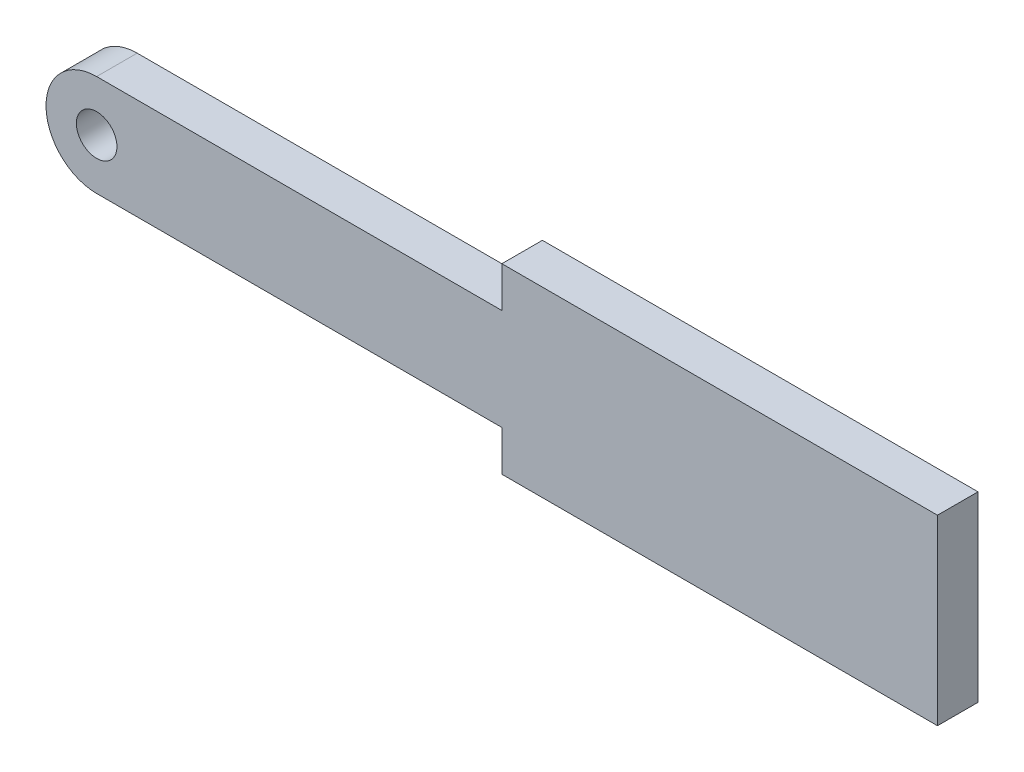
ISO-10303-21;
HEADER;
FILE_DESCRIPTION(('STEP AP214'),'2;1');
FILE_NAME('part.step','',(''),(''),'','','');
FILE_SCHEMA(('AUTOMOTIVE_DESIGN { 1 0 10303 214 1 1 1 1 }'));
ENDSEC;
DATA;
#1=APPLICATION_CONTEXT('core data for automotive mechanical design processes');
#2=APPLICATION_PROTOCOL_DEFINITION('international standard','automotive_design',2000,#1);
#3=PRODUCT_CONTEXT('',#1,'mechanical');
#4=PRODUCT('Part','Part','',(#3));
#5=PRODUCT_RELATED_PRODUCT_CATEGORY('part','',(#4));
#6=PRODUCT_DEFINITION_FORMATION('','',#4);
#7=PRODUCT_DEFINITION_CONTEXT('part definition',#1,'design');
#8=PRODUCT_DEFINITION('design','',#6,#7);
#9=PRODUCT_DEFINITION_SHAPE('','',#8);
#10=(LENGTH_UNIT() NAMED_UNIT(*) SI_UNIT(.MILLI.,.METRE.));
#11=(NAMED_UNIT(*) PLANE_ANGLE_UNIT() SI_UNIT($,.RADIAN.));
#12=(NAMED_UNIT(*) SI_UNIT($,.STERADIAN.) SOLID_ANGLE_UNIT());
#13=UNCERTAINTY_MEASURE_WITH_UNIT(LENGTH_MEASURE(1.E-05),#10,'distance_accuracy_value','');
#14=(GEOMETRIC_REPRESENTATION_CONTEXT(3) GLOBAL_UNCERTAINTY_ASSIGNED_CONTEXT((#13)) GLOBAL_UNIT_ASSIGNED_CONTEXT((#10,
#11,#12)) REPRESENTATION_CONTEXT('',''));
#15=CARTESIAN_POINT('',(0.,0.,0.));
#16=DIRECTION('',(0.,0.,1.));
#17=DIRECTION('',(1.,0.,0.));
#18=AXIS2_PLACEMENT_3D('',#15,#16,#17);
#19=CARTESIAN_POINT('',(-21.5,0.,4.));
#20=DIRECTION('',(-1.,0.,0.));
#21=DIRECTION('',(0.,0.,1.));
#22=AXIS2_PLACEMENT_3D('',#19,#20,#21);
#23=PLANE('',#22);
#24=DIRECTION('',(0.,1.,0.));
#25=VECTOR('',#24,1.);
#26=CARTESIAN_POINT('',(-21.5,0.,0.));
#27=LINE('',#26,#25);
#28=CARTESIAN_POINT('',(-21.5,5.,0.));
#29=VERTEX_POINT('',#28);
#30=CARTESIAN_POINT('',(-21.5,9.,0.));
#31=VERTEX_POINT('',#30);
#32=EDGE_CURVE('E275',#29,#31,#27,.T.);
#33=ORIENTED_EDGE('',*,*,#32,.F.);
#34=DIRECTION('',(0.,0.,1.));
#35=VECTOR('',#34,1.);
#36=CARTESIAN_POINT('',(-21.5,5.,0.));
#37=LINE('',#36,#35);
#38=CARTESIAN_POINT('',(-21.5,5.,4.));
#39=VERTEX_POINT('',#38);
#40=EDGE_CURVE('E193',#29,#39,#37,.T.);
#41=ORIENTED_EDGE('',*,*,#40,.T.);
#42=DIRECTION('',(0.,1.,0.));
#43=VECTOR('',#42,1.);
#44=CARTESIAN_POINT('',(-21.5,0.,4.));
#45=LINE('',#44,#43);
#46=CARTESIAN_POINT('',(-21.5,9.,4.));
#47=VERTEX_POINT('',#46);
#48=EDGE_CURVE('E262',#39,#47,#45,.T.);
#49=ORIENTED_EDGE('',*,*,#48,.T.);
#50=DIRECTION('',(0.,0.,-1.));
#51=VECTOR('',#50,1.);
#52=CARTESIAN_POINT('',(-21.5,9.,4.));
#53=LINE('',#52,#51);
#54=EDGE_CURVE('E278',#47,#31,#53,.T.);
#55=ORIENTED_EDGE('',*,*,#54,.T.);
#56=EDGE_LOOP('',(#33,#41,#49,#55));
#57=FACE_BOUND('',#56,.T.);
#58=ADVANCED_FACE('F38',(#57),#23,.T.);
#59=CARTESIAN_POINT('',(0.,0.,0.));
#60=DIRECTION('',(0.,0.,1.));
#61=DIRECTION('',(1.,0.,0.));
#62=AXIS2_PLACEMENT_3D('',#59,#60,#61);
#63=PLANE('',#62);
#64=DIRECTION('',(1.,0.,0.));
#65=VECTOR('',#64,1.);
#66=CARTESIAN_POINT('',(0.,-9.,0.));
#67=LINE('',#66,#65);
#68=CARTESIAN_POINT('',(-21.5,-9.,0.));
#69=VERTEX_POINT('',#68);
#70=CARTESIAN_POINT('',(21.5,-9.,0.));
#71=VERTEX_POINT('',#70);
#72=EDGE_CURVE('E253',#69,#71,#67,.T.);
#73=ORIENTED_EDGE('',*,*,#72,.F.);
#74=CARTESIAN_POINT('',(-21.5,-5.,0.));
#75=VERTEX_POINT('',#74);
#76=EDGE_CURVE('E162',#69,#75,#27,.T.);
#77=ORIENTED_EDGE('',*,*,#76,.T.);
#78=DIRECTION('',(-1.,0.,0.));
#79=VECTOR('',#78,1.);
#80=CARTESIAN_POINT('',(0.,-5.,0.));
#81=LINE('',#80,#79);
#82=CARTESIAN_POINT('',(-61.5,-5.00000000000001,0.));
#83=VERTEX_POINT('',#82);
#84=EDGE_CURVE('E152',#75,#83,#81,.T.);
#85=ORIENTED_EDGE('',*,*,#84,.T.);
#86=CARTESIAN_POINT('',(-61.5,0.,0.));
#87=DIRECTION('',(0.,0.,1.));
#88=DIRECTION('',(1.,0.,0.));
#89=AXIS2_PLACEMENT_3D('',#86,#87,#88);
#90=CIRCLE('',#89,5.);
#91=CARTESIAN_POINT('',(-61.5,5.,0.));
#92=VERTEX_POINT('',#91);
#93=EDGE_CURVE('E159',#92,#83,#90,.T.);
#94=ORIENTED_EDGE('',*,*,#93,.F.);
#95=DIRECTION('',(-1.,0.,0.));
#96=VECTOR('',#95,1.);
#97=CARTESIAN_POINT('',(0.,5.,0.));
#98=LINE('',#97,#96);
#99=EDGE_CURVE('E166',#29,#92,#98,.T.);
#100=ORIENTED_EDGE('',*,*,#99,.F.);
#101=ORIENTED_EDGE('',*,*,#32,.T.);
#102=DIRECTION('',(1.,0.,0.));
#103=VECTOR('',#102,1.);
#104=CARTESIAN_POINT('',(0.,9.,0.));
#105=LINE('',#104,#103);
#106=CARTESIAN_POINT('',(21.5,9.,0.));
#107=VERTEX_POINT('',#106);
#108=EDGE_CURVE('E272',#31,#107,#105,.T.);
#109=ORIENTED_EDGE('',*,*,#108,.T.);
#110=DIRECTION('',(0.,1.,0.));
#111=VECTOR('',#110,1.);
#112=CARTESIAN_POINT('',(21.5,0.,0.));
#113=LINE('',#112,#111);
#114=EDGE_CURVE('E269',#71,#107,#113,.T.);
#115=ORIENTED_EDGE('',*,*,#114,.F.);
#116=EDGE_LOOP('',(#73,#77,#85,#94,#100,#101,#109,#115));
#117=FACE_BOUND('',#116,.T.);
#118=CARTESIAN_POINT('',(0.,0.,0.));
#119=DIRECTION('',(0.,0.,1.));
#120=DIRECTION('',(1.,0.,0.));
#121=AXIS2_PLACEMENT_3D('',#118,#119,#120);
#122=CIRCLE('',#121,6.4);
#123=CARTESIAN_POINT('',(-4.51489762889421,-4.53604446633909,0.));
#124=VERTEX_POINT('',#123);
#125=CARTESIAN_POINT('',(4.51489762889421,-4.53604446633909,0.));
#126=VERTEX_POINT('',#125);
#127=EDGE_CURVE('E200',#124,#126,#122,.T.);
#128=ORIENTED_EDGE('',*,*,#127,.T.);
#129=DIRECTION('',(-0.989359135364853,-0.145493990494831,0.));
#130=VECTOR('',#129,1.);
#131=CARTESIAN_POINT('',(0.748518204911092,-5.08992379339543,0.));
#132=LINE('',#131,#130);
#133=CARTESIAN_POINT('',(17.,-2.7,0.));
#134=VERTEX_POINT('',#133);
#135=EDGE_CURVE('E61',#134,#126,#132,.T.);
#136=ORIENTED_EDGE('',*,*,#135,.F.);
#137=CARTESIAN_POINT('',(17.,0.,0.));
#138=DIRECTION('',(0.,0.,1.));
#139=DIRECTION('',(1.,0.,0.));
#140=AXIS2_PLACEMENT_3D('',#137,#138,#139);
#141=CIRCLE('',#140,2.7);
#142=CARTESIAN_POINT('',(17.,2.7,0.));
#143=VERTEX_POINT('',#142);
#144=EDGE_CURVE('E218',#143,#134,#141,.F.);
#145=ORIENTED_EDGE('',*,*,#144,.F.);
#146=DIRECTION('',(-0.989359135364853,0.145493990494831,0.));
#147=VECTOR('',#146,1.);
#148=CARTESIAN_POINT('',(0.748518204911092,5.08992379339543,0.));
#149=LINE('',#148,#147);
#150=CARTESIAN_POINT('',(4.51489762889421,4.53604446633909,0.));
#151=VERTEX_POINT('',#150);
#152=EDGE_CURVE('E221',#143,#151,#149,.T.);
#153=ORIENTED_EDGE('',*,*,#152,.T.);
#154=CARTESIAN_POINT('',(0.,0.,0.));
#155=DIRECTION('',(0.,0.,1.));
#156=DIRECTION('',(1.,0.,0.));
#157=AXIS2_PLACEMENT_3D('',#154,#155,#156);
#158=CIRCLE('',#157,6.4);
#159=CARTESIAN_POINT('',(-4.51489762889421,4.53604446633909,0.));
#160=VERTEX_POINT('',#159);
#161=EDGE_CURVE('E224',#151,#160,#158,.T.);
#162=ORIENTED_EDGE('',*,*,#161,.T.);
#163=DIRECTION('',(0.989359135364853,0.145493990494831,0.));
#164=VECTOR('',#163,1.);
#165=CARTESIAN_POINT('',(-0.748518204911092,5.08992379339543,0.));
#166=LINE('',#165,#164);
#167=CARTESIAN_POINT('',(-17.,2.7,0.));
#168=VERTEX_POINT('',#167);
#169=EDGE_CURVE('E227',#168,#160,#166,.T.);
#170=ORIENTED_EDGE('',*,*,#169,.F.);
#171=CARTESIAN_POINT('',(-17.,0.,0.));
#172=DIRECTION('',(0.,0.,1.));
#173=DIRECTION('',(1.,0.,0.));
#174=AXIS2_PLACEMENT_3D('',#171,#172,#173);
#175=CIRCLE('',#174,2.7);
#176=CARTESIAN_POINT('',(-17.,-2.7,0.));
#177=VERTEX_POINT('',#176);
#178=EDGE_CURVE('E230',#168,#177,#175,.T.);
#179=ORIENTED_EDGE('',*,*,#178,.T.);
#180=DIRECTION('',(0.989359135364853,-0.145493990494831,0.));
#181=VECTOR('',#180,1.);
#182=CARTESIAN_POINT('',(-0.748518204911092,-5.08992379339543,0.));
#183=LINE('',#182,#181);
#184=EDGE_CURVE('E233',#177,#124,#183,.T.);
#185=ORIENTED_EDGE('',*,*,#184,.T.);
#186=EDGE_LOOP('',(#128,#136,#145,#153,#162,#170,#179,#185));
#187=FACE_BOUND('',#186,.T.);
#188=CARTESIAN_POINT('',(-61.5,0.,0.));
#189=DIRECTION('',(0.,0.,1.));
#190=DIRECTION('',(1.,0.,0.));
#191=AXIS2_PLACEMENT_3D('',#188,#189,#190);
#192=CIRCLE('',#191,2.);
#193=CARTESIAN_POINT('',(-59.5,0.,0.));
#194=VERTEX_POINT('',#193);
#195=EDGE_CURVE('E179',#194,#194,#192,.T.);
#196=ORIENTED_EDGE('',*,*,#195,.T.);
#197=EDGE_LOOP('',(#196));
#198=FACE_BOUND('',#197,.T.);
#199=ADVANCED_FACE('F155',(#117,#187,#198),#63,.F.);
#200=CARTESIAN_POINT('',(0.,-9.,4.));
#201=DIRECTION('',(0.,1.,0.));
#202=DIRECTION('',(0.,0.,1.));
#203=AXIS2_PLACEMENT_3D('',#200,#201,#202);
#204=PLANE('',#203);
#205=ORIENTED_EDGE('',*,*,#72,.T.);
#206=DIRECTION('',(0.,0.,-1.));
#207=VECTOR('',#206,1.);
#208=CARTESIAN_POINT('',(21.5,-9.,4.));
#209=LINE('',#208,#207);
#210=CARTESIAN_POINT('',(21.5,-9.,4.));
#211=VERTEX_POINT('',#210);
#212=EDGE_CURVE('E11',#211,#71,#209,.T.);
#213=ORIENTED_EDGE('',*,*,#212,.F.);
#214=DIRECTION('',(1.,0.,0.));
#215=VECTOR('',#214,1.);
#216=CARTESIAN_POINT('',(0.,-9.,4.));
#217=LINE('',#216,#215);
#218=CARTESIAN_POINT('',(-21.5,-9.,4.));
#219=VERTEX_POINT('',#218);
#220=EDGE_CURVE('E254',#219,#211,#217,.T.);
#221=ORIENTED_EDGE('',*,*,#220,.F.);
#222=DIRECTION('',(0.,0.,-1.));
#223=VECTOR('',#222,1.);
#224=CARTESIAN_POINT('',(-21.5,-9.,4.));
#225=LINE('',#224,#223);
#226=EDGE_CURVE('E266',#219,#69,#225,.T.);
#227=ORIENTED_EDGE('',*,*,#226,.T.);
#228=EDGE_LOOP('',(#205,#213,#221,#227));
#229=FACE_BOUND('',#228,.T.);
#230=ADVANCED_FACE('F40',(#229),#204,.F.);
#231=CARTESIAN_POINT('',(21.5,0.,4.));
#232=DIRECTION('',(-1.,0.,0.));
#233=DIRECTION('',(0.,0.,1.));
#234=AXIS2_PLACEMENT_3D('',#231,#232,#233);
#235=PLANE('',#234);
#236=ORIENTED_EDGE('',*,*,#114,.T.);
#237=DIRECTION('',(0.,0.,-1.));
#238=VECTOR('',#237,1.);
#239=CARTESIAN_POINT('',(21.5,9.,4.));
#240=LINE('',#239,#238);
#241=CARTESIAN_POINT('',(21.5,9.,4.));
#242=VERTEX_POINT('',#241);
#243=EDGE_CURVE('E46',#242,#107,#240,.T.);
#244=ORIENTED_EDGE('',*,*,#243,.F.);
#245=DIRECTION('',(0.,1.,0.));
#246=VECTOR('',#245,1.);
#247=CARTESIAN_POINT('',(21.5,0.,4.));
#248=LINE('',#247,#246);
#249=EDGE_CURVE('E257',#211,#242,#248,.T.);
#250=ORIENTED_EDGE('',*,*,#249,.F.);
#251=ORIENTED_EDGE('',*,*,#212,.T.);
#252=EDGE_LOOP('',(#236,#244,#250,#251));
#253=FACE_BOUND('',#252,.T.);
#254=ADVANCED_FACE('F287',(#253),#235,.F.);
#255=CARTESIAN_POINT('',(0.,9.,4.));
#256=DIRECTION('',(0.,1.,0.));
#257=DIRECTION('',(0.,0.,1.));
#258=AXIS2_PLACEMENT_3D('',#255,#256,#257);
#259=PLANE('',#258);
#260=ORIENTED_EDGE('',*,*,#108,.F.);
#261=ORIENTED_EDGE('',*,*,#54,.F.);
#262=DIRECTION('',(1.,0.,0.));
#263=VECTOR('',#262,1.);
#264=CARTESIAN_POINT('',(0.,9.,4.));
#265=LINE('',#264,#263);
#266=EDGE_CURVE('E259',#47,#242,#265,.T.);
#267=ORIENTED_EDGE('',*,*,#266,.T.);
#268=ORIENTED_EDGE('',*,*,#243,.T.);
#269=EDGE_LOOP('',(#260,#261,#267,#268));
#270=FACE_BOUND('',#269,.T.);
#271=ADVANCED_FACE('F283',(#270),#259,.T.);
#272=DIRECTION('',(0.,0.,1.));
#273=VECTOR('',#272,1.);
#274=CARTESIAN_POINT('',(-21.5,-5.,0.));
#275=LINE('',#274,#273);
#276=CARTESIAN_POINT('',(-21.5,-5.,4.));
#277=VERTEX_POINT('',#276);
#278=EDGE_CURVE('E175',#75,#277,#275,.T.);
#279=ORIENTED_EDGE('',*,*,#278,.F.);
#280=ORIENTED_EDGE('',*,*,#76,.F.);
#281=ORIENTED_EDGE('',*,*,#226,.F.);
#282=EDGE_CURVE('E263',#219,#277,#45,.T.);
#283=ORIENTED_EDGE('',*,*,#282,.T.);
#284=EDGE_LOOP('',(#279,#280,#281,#283));
#285=FACE_BOUND('',#284,.T.);
#286=ADVANCED_FACE('F299',(#285),#23,.T.);
#287=CARTESIAN_POINT('',(0.,0.,4.));
#288=DIRECTION('',(0.,0.,1.));
#289=DIRECTION('',(1.,0.,0.));
#290=AXIS2_PLACEMENT_3D('',#287,#288,#289);
#291=PLANE('',#290);
#292=ORIENTED_EDGE('',*,*,#220,.T.);
#293=ORIENTED_EDGE('',*,*,#249,.T.);
#294=ORIENTED_EDGE('',*,*,#266,.F.);
#295=ORIENTED_EDGE('',*,*,#48,.F.);
#296=DIRECTION('',(-1.,0.,0.));
#297=VECTOR('',#296,1.);
#298=CARTESIAN_POINT('',(0.,5.,4.));
#299=LINE('',#298,#297);
#300=CARTESIAN_POINT('',(-61.5,5.,4.));
#301=VERTEX_POINT('',#300);
#302=EDGE_CURVE('E53',#39,#301,#299,.T.);
#303=ORIENTED_EDGE('',*,*,#302,.T.);
#304=CARTESIAN_POINT('',(-61.5,0.,4.));
#305=DIRECTION('',(0.,0.,1.));
#306=DIRECTION('',(1.,0.,0.));
#307=AXIS2_PLACEMENT_3D('',#304,#305,#306);
#308=CIRCLE('',#307,5.);
#309=CARTESIAN_POINT('',(-61.5,-5.00000000000001,4.));
#310=VERTEX_POINT('',#309);
#311=EDGE_CURVE('E188',#301,#310,#308,.T.);
#312=ORIENTED_EDGE('',*,*,#311,.T.);
#313=DIRECTION('',(-1.,0.,0.));
#314=VECTOR('',#313,1.);
#315=CARTESIAN_POINT('',(0.,-5.,4.));
#316=LINE('',#315,#314);
#317=EDGE_CURVE('E171',#277,#310,#316,.T.);
#318=ORIENTED_EDGE('',*,*,#317,.F.);
#319=ORIENTED_EDGE('',*,*,#282,.F.);
#320=EDGE_LOOP('',(#292,#293,#294,#295,#303,#312,#318,#319));
#321=FACE_BOUND('',#320,.T.);
#322=CARTESIAN_POINT('',(-61.5,0.,4.));
#323=DIRECTION('',(0.,0.,1.));
#324=DIRECTION('',(1.,0.,0.));
#325=AXIS2_PLACEMENT_3D('',#322,#323,#324);
#326=CIRCLE('',#325,2.);
#327=CARTESIAN_POINT('',(-59.5,0.,4.));
#328=VERTEX_POINT('',#327);
#329=EDGE_CURVE('E185',#328,#328,#326,.T.);
#330=ORIENTED_EDGE('',*,*,#329,.F.);
#331=EDGE_LOOP('',(#330));
#332=FACE_BOUND('',#331,.T.);
#333=ADVANCED_FACE('F293',(#321,#332),#291,.T.);
#334=CARTESIAN_POINT('',(0.748518204911092,-5.08992379339543,2.3));
#335=DIRECTION('',(0.145493990494831,-0.989359135364853,0.));
#336=DIRECTION('',(0.989359135364853,0.145493990494831,0.));
#337=AXIS2_PLACEMENT_3D('',#334,#335,#336);
#338=PLANE('',#337);
#339=ORIENTED_EDGE('',*,*,#135,.T.);
#340=DIRECTION('',(0.,0.,-1.));
#341=VECTOR('',#340,1.);
#342=CARTESIAN_POINT('',(4.51489762889421,-4.53604446633909,2.3));
#343=LINE('',#342,#341);
#344=CARTESIAN_POINT('',(4.51489762889421,-4.53604446633909,2.3));
#345=VERTEX_POINT('',#344);
#346=EDGE_CURVE('E216',#345,#126,#343,.T.);
#347=ORIENTED_EDGE('',*,*,#346,.F.);
#348=DIRECTION('',(-0.989359135364853,-0.145493990494831,0.));
#349=VECTOR('',#348,1.);
#350=CARTESIAN_POINT('',(0.748518204911092,-5.08992379339543,2.3));
#351=LINE('',#350,#349);
#352=CARTESIAN_POINT('',(17.,-2.7,2.3));
#353=VERTEX_POINT('',#352);
#354=EDGE_CURVE('E196',#353,#345,#351,.T.);
#355=ORIENTED_EDGE('',*,*,#354,.F.);
#356=DIRECTION('',(0.,0.,-1.));
#357=VECTOR('',#356,1.);
#358=CARTESIAN_POINT('',(17.,-2.7,2.3));
#359=LINE('',#358,#357);
#360=EDGE_CURVE('E251',#353,#134,#359,.T.);
#361=ORIENTED_EDGE('',*,*,#360,.T.);
#362=EDGE_LOOP('',(#339,#347,#355,#361));
#363=FACE_BOUND('',#362,.T.);
#364=ADVANCED_FACE('F306',(#363),#338,.F.);
#365=CARTESIAN_POINT('',(17.,0.,2.3));
#366=DIRECTION('',(0.,0.,-1.));
#367=DIRECTION('',(-1.,0.,0.));
#368=AXIS2_PLACEMENT_3D('',#365,#366,#367);
#369=CYLINDRICAL_SURFACE('',#368,2.7);
#370=ORIENTED_EDGE('',*,*,#144,.T.);
#371=ORIENTED_EDGE('',*,*,#360,.F.);
#372=CARTESIAN_POINT('',(17.,0.,2.3));
#373=DIRECTION('',(0.,0.,1.));
#374=DIRECTION('',(1.,0.,0.));
#375=AXIS2_PLACEMENT_3D('',#372,#373,#374);
#376=CIRCLE('',#375,2.7);
#377=CARTESIAN_POINT('',(17.,2.7,2.3));
#378=VERTEX_POINT('',#377);
#379=EDGE_CURVE('E199',#378,#353,#376,.F.);
#380=ORIENTED_EDGE('',*,*,#379,.F.);
#381=DIRECTION('',(0.,0.,-1.));
#382=VECTOR('',#381,1.);
#383=CARTESIAN_POINT('',(17.,2.7,2.3));
#384=LINE('',#383,#382);
#385=EDGE_CURVE('E249',#378,#143,#384,.T.);
#386=ORIENTED_EDGE('',*,*,#385,.T.);
#387=EDGE_LOOP('',(#370,#371,#380,#386));
#388=FACE_BOUND('',#387,.T.);
#389=ADVANCED_FACE('F320',(#388),#369,.F.);
#390=CARTESIAN_POINT('',(0.748518204911092,5.08992379339543,2.3));
#391=DIRECTION('',(-0.145493990494831,-0.989359135364853,0.));
#392=DIRECTION('',(0.989359135364853,-0.145493990494831,0.));
#393=AXIS2_PLACEMENT_3D('',#390,#391,#392);
#394=PLANE('',#393);
#395=ORIENTED_EDGE('',*,*,#152,.F.);
#396=ORIENTED_EDGE('',*,*,#385,.F.);
#397=DIRECTION('',(-0.989359135364853,0.145493990494831,0.));
#398=VECTOR('',#397,1.);
#399=CARTESIAN_POINT('',(0.748518204911092,5.08992379339543,2.3));
#400=LINE('',#399,#398);
#401=CARTESIAN_POINT('',(4.51489762889421,4.53604446633909,2.3));
#402=VERTEX_POINT('',#401);
#403=EDGE_CURVE('E203',#378,#402,#400,.T.);
#404=ORIENTED_EDGE('',*,*,#403,.T.);
#405=DIRECTION('',(0.,0.,-1.));
#406=VECTOR('',#405,1.);
#407=CARTESIAN_POINT('',(4.51489762889421,4.53604446633909,2.3));
#408=LINE('',#407,#406);
#409=EDGE_CURVE('E247',#402,#151,#408,.T.);
#410=ORIENTED_EDGE('',*,*,#409,.T.);
#411=EDGE_LOOP('',(#395,#396,#404,#410));
#412=FACE_BOUND('',#411,.T.);
#413=ADVANCED_FACE('F323',(#412),#394,.T.);
#414=CARTESIAN_POINT('',(0.,0.,2.3));
#415=DIRECTION('',(0.,0.,-1.));
#416=DIRECTION('',(-1.,0.,0.));
#417=AXIS2_PLACEMENT_3D('',#414,#415,#416);
#418=CYLINDRICAL_SURFACE('',#417,6.4);
#419=ORIENTED_EDGE('',*,*,#161,.F.);
#420=ORIENTED_EDGE('',*,*,#409,.F.);
#421=CARTESIAN_POINT('',(0.,0.,2.3));
#422=DIRECTION('',(0.,0.,1.));
#423=DIRECTION('',(1.,0.,0.));
#424=AXIS2_PLACEMENT_3D('',#421,#422,#423);
#425=CIRCLE('',#424,6.4);
#426=CARTESIAN_POINT('',(-4.51489762889421,4.53604446633909,2.3));
#427=VERTEX_POINT('',#426);
#428=EDGE_CURVE('E205',#402,#427,#425,.T.);
#429=ORIENTED_EDGE('',*,*,#428,.T.);
#430=DIRECTION('',(0.,0.,-1.));
#431=VECTOR('',#430,1.);
#432=CARTESIAN_POINT('',(-4.51489762889421,4.53604446633909,2.3));
#433=LINE('',#432,#431);
#434=EDGE_CURVE('E245',#427,#160,#433,.T.);
#435=ORIENTED_EDGE('',*,*,#434,.T.);
#436=EDGE_LOOP('',(#419,#420,#429,#435));
#437=FACE_BOUND('',#436,.T.);
#438=ADVANCED_FACE('F327',(#437),#418,.F.);
#439=CARTESIAN_POINT('',(-0.748518204911092,5.08992379339543,2.3));
#440=DIRECTION('',(-0.145493990494831,0.989359135364853,0.));
#441=DIRECTION('',(-0.989359135364853,-0.145493990494831,0.));
#442=AXIS2_PLACEMENT_3D('',#439,#440,#441);
#443=PLANE('',#442);
#444=ORIENTED_EDGE('',*,*,#169,.T.);
#445=ORIENTED_EDGE('',*,*,#434,.F.);
#446=DIRECTION('',(0.989359135364853,0.145493990494831,0.));
#447=VECTOR('',#446,1.);
#448=CARTESIAN_POINT('',(-0.748518204911092,5.08992379339543,2.3));
#449=LINE('',#448,#447);
#450=CARTESIAN_POINT('',(-17.,2.7,2.3));
#451=VERTEX_POINT('',#450);
#452=EDGE_CURVE('E207',#451,#427,#449,.T.);
#453=ORIENTED_EDGE('',*,*,#452,.F.);
#454=DIRECTION('',(0.,0.,-1.));
#455=VECTOR('',#454,1.);
#456=CARTESIAN_POINT('',(-17.,2.7,2.3));
#457=LINE('',#456,#455);
#458=EDGE_CURVE('E243',#451,#168,#457,.T.);
#459=ORIENTED_EDGE('',*,*,#458,.T.);
#460=EDGE_LOOP('',(#444,#445,#453,#459));
#461=FACE_BOUND('',#460,.T.);
#462=ADVANCED_FACE('F331',(#461),#443,.F.);
#463=CARTESIAN_POINT('',(-17.,0.,2.3));
#464=DIRECTION('',(0.,0.,-1.));
#465=DIRECTION('',(-1.,0.,0.));
#466=AXIS2_PLACEMENT_3D('',#463,#464,#465);
#467=CYLINDRICAL_SURFACE('',#466,2.7);
#468=ORIENTED_EDGE('',*,*,#178,.F.);
#469=ORIENTED_EDGE('',*,*,#458,.F.);
#470=CARTESIAN_POINT('',(-17.,0.,2.3));
#471=DIRECTION('',(0.,0.,1.));
#472=DIRECTION('',(1.,0.,0.));
#473=AXIS2_PLACEMENT_3D('',#470,#471,#472);
#474=CIRCLE('',#473,2.7);
#475=CARTESIAN_POINT('',(-17.,-2.7,2.3));
#476=VERTEX_POINT('',#475);
#477=EDGE_CURVE('E210',#451,#476,#474,.T.);
#478=ORIENTED_EDGE('',*,*,#477,.T.);
#479=DIRECTION('',(0.,0.,-1.));
#480=VECTOR('',#479,1.);
#481=CARTESIAN_POINT('',(-17.,-2.7,2.3));
#482=LINE('',#481,#480);
#483=EDGE_CURVE('E241',#476,#177,#482,.T.);
#484=ORIENTED_EDGE('',*,*,#483,.T.);
#485=EDGE_LOOP('',(#468,#469,#478,#484));
#486=FACE_BOUND('',#485,.T.);
#487=ADVANCED_FACE('F335',(#486),#467,.F.);
#488=CARTESIAN_POINT('',(-0.748518204911092,-5.08992379339543,2.3));
#489=DIRECTION('',(0.145493990494831,0.989359135364853,0.));
#490=DIRECTION('',(-0.989359135364853,0.145493990494831,0.));
#491=AXIS2_PLACEMENT_3D('',#488,#489,#490);
#492=PLANE('',#491);
#493=ORIENTED_EDGE('',*,*,#184,.F.);
#494=ORIENTED_EDGE('',*,*,#483,.F.);
#495=DIRECTION('',(0.989359135364853,-0.145493990494831,0.));
#496=VECTOR('',#495,1.);
#497=CARTESIAN_POINT('',(-0.748518204911092,-5.08992379339543,2.3));
#498=LINE('',#497,#496);
#499=CARTESIAN_POINT('',(-4.51489762889421,-4.53604446633909,2.3));
#500=VERTEX_POINT('',#499);
#501=EDGE_CURVE('E212',#476,#500,#498,.T.);
#502=ORIENTED_EDGE('',*,*,#501,.T.);
#503=DIRECTION('',(0.,0.,-1.));
#504=VECTOR('',#503,1.);
#505=CARTESIAN_POINT('',(-4.51489762889421,-4.53604446633909,2.3));
#506=LINE('',#505,#504);
#507=EDGE_CURVE('E239',#500,#124,#506,.T.);
#508=ORIENTED_EDGE('',*,*,#507,.T.);
#509=EDGE_LOOP('',(#493,#494,#502,#508));
#510=FACE_BOUND('',#509,.T.);
#511=ADVANCED_FACE('F339',(#510),#492,.T.);
#512=CARTESIAN_POINT('',(0.,0.,2.3));
#513=DIRECTION('',(0.,0.,-1.));
#514=DIRECTION('',(-1.,0.,0.));
#515=AXIS2_PLACEMENT_3D('',#512,#513,#514);
#516=CYLINDRICAL_SURFACE('',#515,6.4);
#517=ORIENTED_EDGE('',*,*,#127,.F.);
#518=ORIENTED_EDGE('',*,*,#507,.F.);
#519=CARTESIAN_POINT('',(0.,0.,2.3));
#520=DIRECTION('',(0.,0.,1.));
#521=DIRECTION('',(1.,0.,0.));
#522=AXIS2_PLACEMENT_3D('',#519,#520,#521);
#523=CIRCLE('',#522,6.4);
#524=EDGE_CURVE('E214',#500,#345,#523,.T.);
#525=ORIENTED_EDGE('',*,*,#524,.T.);
#526=ORIENTED_EDGE('',*,*,#346,.T.);
#527=EDGE_LOOP('',(#517,#518,#525,#526));
#528=FACE_BOUND('',#527,.T.);
#529=ADVANCED_FACE('F343',(#528),#516,.F.);
#530=CARTESIAN_POINT('',(0.,0.,2.3));
#531=DIRECTION('',(0.,0.,1.));
#532=DIRECTION('',(1.,0.,0.));
#533=AXIS2_PLACEMENT_3D('',#530,#531,#532);
#534=PLANE('',#533);
#535=ORIENTED_EDGE('',*,*,#354,.T.);
#536=ORIENTED_EDGE('',*,*,#524,.F.);
#537=ORIENTED_EDGE('',*,*,#501,.F.);
#538=ORIENTED_EDGE('',*,*,#477,.F.);
#539=ORIENTED_EDGE('',*,*,#452,.T.);
#540=ORIENTED_EDGE('',*,*,#428,.F.);
#541=ORIENTED_EDGE('',*,*,#403,.F.);
#542=ORIENTED_EDGE('',*,*,#379,.T.);
#543=EDGE_LOOP('',(#535,#536,#537,#538,#539,#540,#541,#542));
#544=FACE_BOUND('',#543,.T.);
#545=ADVANCED_FACE('F347',(#544),#534,.F.);
#546=CARTESIAN_POINT('',(-61.5,0.,0.));
#547=DIRECTION('',(0.,0.,1.));
#548=DIRECTION('',(1.,0.,0.));
#549=AXIS2_PLACEMENT_3D('',#546,#547,#548);
#550=CYLINDRICAL_SURFACE('',#549,5.);
#551=ORIENTED_EDGE('',*,*,#311,.F.);
#552=DIRECTION('',(0.,0.,1.));
#553=VECTOR('',#552,1.);
#554=CARTESIAN_POINT('',(-61.5,5.,0.));
#555=LINE('',#554,#553);
#556=EDGE_CURVE('E178',#92,#301,#555,.T.);
#557=ORIENTED_EDGE('',*,*,#556,.F.);
#558=ORIENTED_EDGE('',*,*,#93,.T.);
#559=DIRECTION('',(0.,0.,1.));
#560=VECTOR('',#559,1.);
#561=CARTESIAN_POINT('',(-61.5,-5.00000000000001,0.));
#562=LINE('',#561,#560);
#563=EDGE_CURVE('E169',#83,#310,#562,.T.);
#564=ORIENTED_EDGE('',*,*,#563,.T.);
#565=EDGE_LOOP('',(#551,#557,#558,#564));
#566=FACE_BOUND('',#565,.T.);
#567=ADVANCED_FACE('F177',(#566),#550,.T.);
#568=CARTESIAN_POINT('',(0.,5.,0.));
#569=DIRECTION('',(0.,1.,0.));
#570=DIRECTION('',(-1.,0.,0.));
#571=AXIS2_PLACEMENT_3D('',#568,#569,#570);
#572=PLANE('',#571);
#573=ORIENTED_EDGE('',*,*,#302,.F.);
#574=ORIENTED_EDGE('',*,*,#40,.F.);
#575=ORIENTED_EDGE('',*,*,#99,.T.);
#576=ORIENTED_EDGE('',*,*,#556,.T.);
#577=EDGE_LOOP('',(#573,#574,#575,#576));
#578=FACE_BOUND('',#577,.T.);
#579=ADVANCED_FACE('F355',(#578),#572,.T.);
#580=CARTESIAN_POINT('',(-61.5,0.,0.));
#581=DIRECTION('',(0.,0.,1.));
#582=DIRECTION('',(1.,0.,0.));
#583=AXIS2_PLACEMENT_3D('',#580,#581,#582);
#584=CYLINDRICAL_SURFACE('',#583,2.);
#585=ORIENTED_EDGE('',*,*,#195,.F.);
#586=EDGE_LOOP('',(#585));
#587=FACE_BOUND('',#586,.T.);
#588=ORIENTED_EDGE('',*,*,#329,.T.);
#589=EDGE_LOOP('',(#588));
#590=FACE_BOUND('',#589,.T.);
#591=ADVANCED_FACE('F352',(#587,#590),#584,.F.);
#592=CARTESIAN_POINT('',(0.,-5.,0.));
#593=DIRECTION('',(0.,1.,0.));
#594=DIRECTION('',(-1.,0.,0.));
#595=AXIS2_PLACEMENT_3D('',#592,#593,#594);
#596=PLANE('',#595);
#597=ORIENTED_EDGE('',*,*,#317,.T.);
#598=ORIENTED_EDGE('',*,*,#563,.F.);
#599=ORIENTED_EDGE('',*,*,#84,.F.);
#600=ORIENTED_EDGE('',*,*,#278,.T.);
#601=EDGE_LOOP('',(#597,#598,#599,#600));
#602=FACE_BOUND('',#601,.T.);
#603=ADVANCED_FACE('F170',(#602),#596,.F.);
#604=CLOSED_SHELL('',(#58,#199,#230,#254,#271,#286,#333,#364,#389,#413,#438,#462,#487,#511,#529,
#545,#567,#579,#591,#603));
#605=MANIFOLD_SOLID_BREP('B2',#604);
#606=ADVANCED_BREP_SHAPE_REPRESENTATION('',(#18,#605),#14);
#607=SHAPE_DEFINITION_REPRESENTATION(#9,#606);
ENDSEC;
END-ISO-10303-21;
